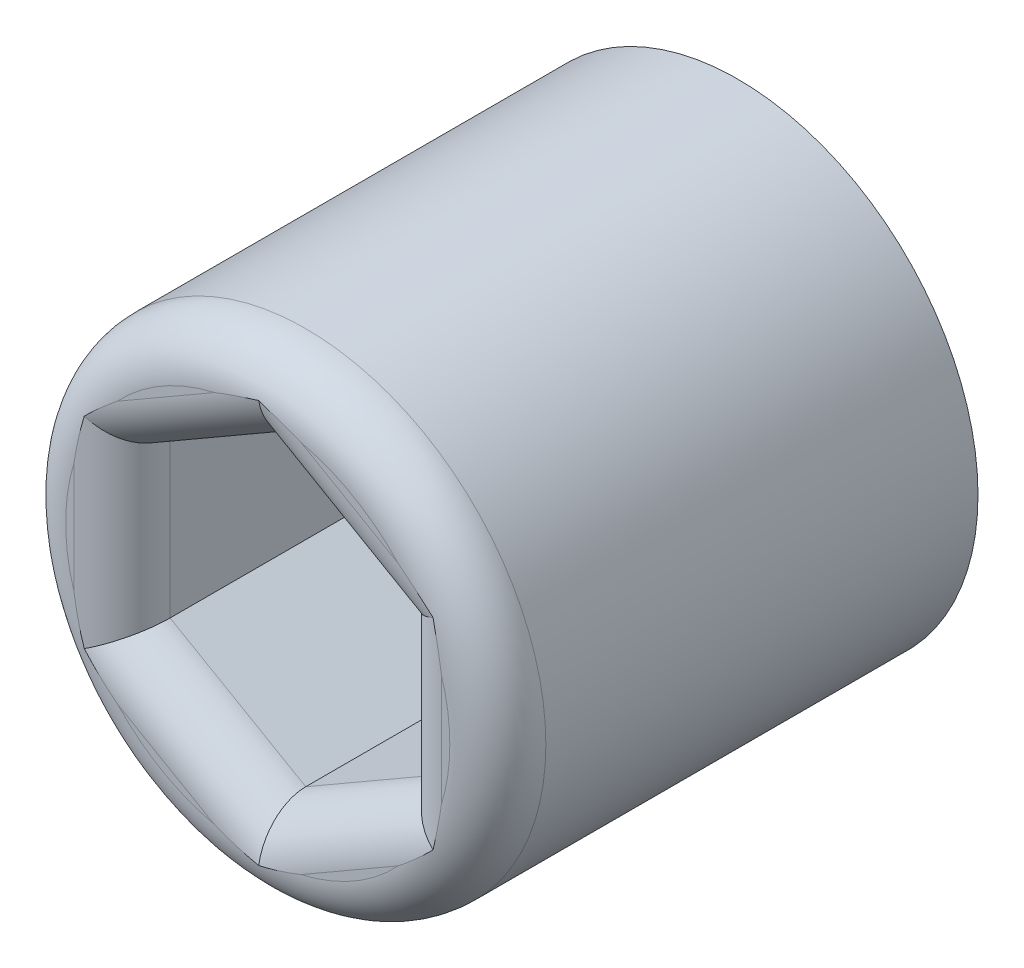
ISO-10303-21;
HEADER;
FILE_DESCRIPTION(('STEP AP214'),'2;1');
FILE_NAME('part.step','',(''),(''),'','','');
FILE_SCHEMA(('AUTOMOTIVE_DESIGN { 1 0 10303 214 1 1 1 1 }'));
ENDSEC;
DATA;
#1=APPLICATION_CONTEXT('core data for automotive mechanical design processes');
#2=APPLICATION_PROTOCOL_DEFINITION('international standard','automotive_design',2000,#1);
#3=PRODUCT_CONTEXT('',#1,'mechanical');
#4=PRODUCT('Part','Part','',(#3));
#5=PRODUCT_RELATED_PRODUCT_CATEGORY('part','',(#4));
#6=PRODUCT_DEFINITION_FORMATION('','',#4);
#7=PRODUCT_DEFINITION_CONTEXT('part definition',#1,'design');
#8=PRODUCT_DEFINITION('design','',#6,#7);
#9=PRODUCT_DEFINITION_SHAPE('','',#8);
#10=(LENGTH_UNIT() NAMED_UNIT(*) SI_UNIT(.MILLI.,.METRE.));
#11=(NAMED_UNIT(*) PLANE_ANGLE_UNIT() SI_UNIT($,.RADIAN.));
#12=(NAMED_UNIT(*) SI_UNIT($,.STERADIAN.) SOLID_ANGLE_UNIT());
#13=UNCERTAINTY_MEASURE_WITH_UNIT(LENGTH_MEASURE(1.E-05),#10,'distance_accuracy_value','');
#14=(GEOMETRIC_REPRESENTATION_CONTEXT(3) GLOBAL_UNCERTAINTY_ASSIGNED_CONTEXT((#13)) GLOBAL_UNIT_ASSIGNED_CONTEXT((#10,
#11,#12)) REPRESENTATION_CONTEXT('',''));
#15=CARTESIAN_POINT('',(0.,0.,0.));
#16=DIRECTION('',(0.,0.,1.));
#17=DIRECTION('',(1.,0.,0.));
#18=AXIS2_PLACEMENT_3D('',#15,#16,#17);
#19=CARTESIAN_POINT('',(0.,0.,10.));
#20=DIRECTION('',(0.,0.,1.));
#21=DIRECTION('',(1.,0.,0.));
#22=AXIS2_PLACEMENT_3D('',#19,#20,#21);
#23=PLANE('',#22);
#24=DIRECTION('',(0.866025403784439,-0.5,0.));
#25=VECTOR('',#24,1.);
#26=CARTESIAN_POINT('',(-3.325,-2.49703991424513,10.));
#27=LINE('',#26,#25);
#28=CARTESIAN_POINT('',(-0.899074497064536,-3.8976486563989,10.));
#29=VERTEX_POINT('',#28);
#30=CARTESIAN_POINT('',(-2.92592550293546,-2.72744568255206,10.));
#31=VERTEX_POINT('',#30);
#32=EDGE_CURVE('E50',#29,#31,#27,.F.);
#33=ORIENTED_EDGE('',*,*,#32,.T.);
#34=CARTESIAN_POINT('',(0.,0.,10.));
#35=DIRECTION('',(0.,0.,1.));
#36=DIRECTION('',(1.,0.,0.));
#37=AXIS2_PLACEMENT_3D('',#34,#35,#36);
#38=CIRCLE('',#37,4.);
#39=EDGE_CURVE('E204',#31,#29,#38,.T.);
#40=ORIENTED_EDGE('',*,*,#39,.T.);
#41=EDGE_LOOP('',(#33,#40));
#42=FACE_BOUND('',#41,.T.);
#43=ADVANCED_FACE('F35',(#42),#23,.T.);
#44=CARTESIAN_POINT('',(-3.825,1.17020297384685,10.));
#45=VERTEX_POINT('',#44);
#46=CARTESIAN_POINT('',(-3.825,-1.17020297384685,10.));
#47=VERTEX_POINT('',#46);
#48=EDGE_CURVE('E381',#45,#47,#38,.T.);
#49=ORIENTED_EDGE('',*,*,#48,.T.);
#50=DIRECTION('',(0.,-1.,0.));
#51=VECTOR('',#50,1.);
#52=CARTESIAN_POINT('',(-3.825,2.78571504883995,10.));
#53=LINE('',#52,#51);
#54=EDGE_CURVE('E388',#47,#45,#53,.F.);
#55=ORIENTED_EDGE('',*,*,#54,.T.);
#56=EDGE_LOOP('',(#49,#55));
#57=FACE_BOUND('',#56,.T.);
#58=ADVANCED_FACE('F341',(#57),#23,.T.);
#59=CARTESIAN_POINT('',(-0.899074497064539,3.8976486563989,10.));
#60=VERTEX_POINT('',#59);
#61=CARTESIAN_POINT('',(-2.92592550293546,2.72744568255206,10.));
#62=VERTEX_POINT('',#61);
#63=EDGE_CURVE('E203',#60,#62,#38,.T.);
#64=ORIENTED_EDGE('',*,*,#63,.T.);
#65=DIRECTION('',(-0.866025403784439,-0.5,0.));
#66=VECTOR('',#65,1.);
#67=CARTESIAN_POINT('',(0.5,4.70540469389545,10.));
#68=LINE('',#67,#66);
#69=EDGE_CURVE('E403',#62,#60,#68,.F.);
#70=ORIENTED_EDGE('',*,*,#69,.T.);
#71=EDGE_LOOP('',(#64,#70));
#72=FACE_BOUND('',#71,.T.);
#73=ADVANCED_FACE('F347',(#72),#23,.T.);
#74=DIRECTION('',(0.866025403784439,0.5,0.));
#75=VECTOR('',#74,1.);
#76=CARTESIAN_POINT('',(0.5,-4.12805442470582,10.));
#77=LINE('',#76,#75);
#78=CARTESIAN_POINT('',(2.92592550293546,-2.72744568255206,10.));
#79=VERTEX_POINT('',#78);
#80=CARTESIAN_POINT('',(0.89907449706454,-3.8976486563989,10.));
#81=VERTEX_POINT('',#80);
#82=EDGE_CURVE('E420',#79,#81,#77,.F.);
#83=ORIENTED_EDGE('',*,*,#82,.T.);
#84=EDGE_CURVE('E379',#81,#79,#38,.T.);
#85=ORIENTED_EDGE('',*,*,#84,.T.);
#86=EDGE_LOOP('',(#83,#85));
#87=FACE_BOUND('',#86,.T.);
#88=ADVANCED_FACE('F361',(#87),#23,.T.);
#89=DIRECTION('',(0.,1.,0.));
#90=VECTOR('',#89,1.);
#91=CARTESIAN_POINT('',(3.825,-1.63101451046069,10.));
#92=LINE('',#91,#90);
#93=CARTESIAN_POINT('',(3.825,1.17020297384685,10.));
#94=VERTEX_POINT('',#93);
#95=CARTESIAN_POINT('',(3.825,-1.17020297384684,10.));
#96=VERTEX_POINT('',#95);
#97=EDGE_CURVE('E214',#94,#96,#92,.F.);
#98=ORIENTED_EDGE('',*,*,#97,.T.);
#99=EDGE_CURVE('E197',#96,#94,#38,.T.);
#100=ORIENTED_EDGE('',*,*,#99,.T.);
#101=EDGE_LOOP('',(#98,#100));
#102=FACE_BOUND('',#101,.T.);
#103=ADVANCED_FACE('F353',(#102),#23,.T.);
#104=CARTESIAN_POINT('',(0.,0.,10.));
#105=DIRECTION('',(0.,0.,-1.));
#106=DIRECTION('',(-1.,0.,0.));
#107=AXIS2_PLACEMENT_3D('',#104,#105,#106);
#108=CYLINDRICAL_SURFACE('',#107,5.);
#109=CARTESIAN_POINT('',(0.,0.,9.));
#110=DIRECTION('',(0.,0.,1.));
#111=DIRECTION('',(1.,0.,0.));
#112=AXIS2_PLACEMENT_3D('',#109,#110,#111);
#113=CIRCLE('',#112,5.);
#114=CARTESIAN_POINT('',(5.,0.,9.));
#115=VERTEX_POINT('',#114);
#116=EDGE_CURVE('E202',#115,#115,#113,.F.);
#117=ORIENTED_EDGE('',*,*,#116,.T.);
#118=EDGE_LOOP('',(#117));
#119=FACE_BOUND('',#118,.T.);
#120=CARTESIAN_POINT('',(0.,0.,0.));
#121=DIRECTION('',(0.,0.,1.));
#122=DIRECTION('',(1.,0.,0.));
#123=AXIS2_PLACEMENT_3D('',#120,#121,#122);
#124=CIRCLE('',#123,5.);
#125=CARTESIAN_POINT('',(5.,0.,0.));
#126=VERTEX_POINT('',#125);
#127=EDGE_CURVE('E185',#126,#126,#124,.T.);
#128=ORIENTED_EDGE('',*,*,#127,.T.);
#129=EDGE_LOOP('',(#128));
#130=FACE_BOUND('',#129,.T.);
#131=ADVANCED_FACE('F242',(#119,#130),#108,.T.);
#132=CARTESIAN_POINT('',(2.92592550293546,2.72744568255206,10.));
#133=VERTEX_POINT('',#132);
#134=CARTESIAN_POINT('',(0.89907449706454,3.8976486563989,10.));
#135=VERTEX_POINT('',#134);
#136=EDGE_CURVE('E199',#133,#135,#38,.T.);
#137=ORIENTED_EDGE('',*,*,#136,.T.);
#138=DIRECTION('',(-0.866025403784439,0.5,0.));
#139=VECTOR('',#138,1.);
#140=CARTESIAN_POINT('',(3.325,2.49703991424513,10.));
#141=LINE('',#140,#139);
#142=EDGE_CURVE('E210',#135,#133,#141,.F.);
#143=ORIENTED_EDGE('',*,*,#142,.T.);
#144=EDGE_LOOP('',(#137,#143));
#145=FACE_BOUND('',#144,.T.);
#146=ADVANCED_FACE('F343',(#145),#23,.T.);
#147=CARTESIAN_POINT('',(0.,0.,0.));
#148=DIRECTION('',(0.,0.,1.));
#149=DIRECTION('',(1.,0.,0.));
#150=AXIS2_PLACEMENT_3D('',#147,#148,#149);
#151=PLANE('',#150);
#152=CARTESIAN_POINT('',(0.,0.,0.));
#153=DIRECTION('',(0.,0.,1.));
#154=DIRECTION('',(1.,0.,0.));
#155=AXIS2_PLACEMENT_3D('',#152,#153,#154);
#156=CIRCLE('',#155,1.8);
#157=CARTESIAN_POINT('',(1.8,0.,0.));
#158=VERTEX_POINT('',#157);
#159=EDGE_CURVE('E169',#158,#158,#156,.T.);
#160=ORIENTED_EDGE('',*,*,#159,.T.);
#161=EDGE_LOOP('',(#160));
#162=FACE_BOUND('',#161,.T.);
#163=ORIENTED_EDGE('',*,*,#127,.F.);
#164=EDGE_LOOP('',(#163));
#165=FACE_BOUND('',#164,.T.);
#166=ADVANCED_FACE('F351',(#162,#165),#151,.F.);
#167=CARTESIAN_POINT('',(0.,-3.26202902092139,2.));
#168=DIRECTION('',(0.5,-0.866025403784439,0.));
#169=DIRECTION('',(0.866025403784439,0.5,0.));
#170=AXIS2_PLACEMENT_3D('',#167,#168,#169);
#171=PLANE('',#170);
#172=DIRECTION('',(0.,0.,1.));
#173=VECTOR('',#172,1.);
#174=CARTESIAN_POINT('',(0.,-3.26202902092139,2.));
#175=LINE('',#174,#173);
#176=CARTESIAN_POINT('',(0.,-3.26202902092139,2.));
#177=VERTEX_POINT('',#176);
#178=CARTESIAN_POINT('',(0.,-3.26202902092139,9.));
#179=VERTEX_POINT('',#178);
#180=EDGE_CURVE('E183',#177,#179,#175,.T.);
#181=ORIENTED_EDGE('',*,*,#180,.T.);
#182=DIRECTION('',(0.866025403784439,0.5,0.));
#183=VECTOR('',#182,1.);
#184=CARTESIAN_POINT('',(3.825,-1.05366424127107,9.));
#185=LINE('',#184,#183);
#186=CARTESIAN_POINT('',(2.825,-1.63101451046069,9.));
#187=VERTEX_POINT('',#186);
#188=EDGE_CURVE('E150',#179,#187,#185,.T.);
#189=ORIENTED_EDGE('',*,*,#188,.T.);
#190=DIRECTION('',(0.,0.,1.));
#191=VECTOR('',#190,1.);
#192=CARTESIAN_POINT('',(2.825,-1.63101451046069,2.));
#193=LINE('',#192,#191);
#194=CARTESIAN_POINT('',(2.825,-1.63101451046069,2.));
#195=VERTEX_POINT('',#194);
#196=EDGE_CURVE('E142',#195,#187,#193,.T.);
#197=ORIENTED_EDGE('',*,*,#196,.F.);
#198=DIRECTION('',(0.866025403784439,0.5,0.));
#199=VECTOR('',#198,1.);
#200=CARTESIAN_POINT('',(0.,-3.26202902092139,2.));
#201=LINE('',#200,#199);
#202=EDGE_CURVE('E147',#177,#195,#201,.T.);
#203=ORIENTED_EDGE('',*,*,#202,.F.);
#204=EDGE_LOOP('',(#181,#189,#197,#203));
#205=FACE_BOUND('',#204,.T.);
#206=ADVANCED_FACE('F145',(#205),#171,.F.);
#207=CARTESIAN_POINT('',(-2.825,-1.63101451046069,2.));
#208=DIRECTION('',(-0.5,-0.866025403784439,0.));
#209=DIRECTION('',(0.866025403784439,-0.5,0.));
#210=AXIS2_PLACEMENT_3D('',#207,#208,#209);
#211=PLANE('',#210);
#212=DIRECTION('',(0.,0.,1.));
#213=VECTOR('',#212,1.);
#214=CARTESIAN_POINT('',(-2.825,-1.63101451046069,2.));
#215=LINE('',#214,#213);
#216=CARTESIAN_POINT('',(-2.825,-1.63101451046069,2.));
#217=VERTEX_POINT('',#216);
#218=CARTESIAN_POINT('',(-2.825,-1.63101451046069,9.));
#219=VERTEX_POINT('',#218);
#220=EDGE_CURVE('E186',#217,#219,#215,.T.);
#221=ORIENTED_EDGE('',*,*,#220,.T.);
#222=DIRECTION('',(0.866025403784439,-0.5,0.));
#223=VECTOR('',#222,1.);
#224=CARTESIAN_POINT('',(0.999999999999999,-3.83937929011101,9.));
#225=LINE('',#224,#223);
#226=EDGE_CURVE('E414',#219,#179,#225,.T.);
#227=ORIENTED_EDGE('',*,*,#226,.T.);
#228=ORIENTED_EDGE('',*,*,#180,.F.);
#229=DIRECTION('',(0.866025403784439,-0.5,0.));
#230=VECTOR('',#229,1.);
#231=CARTESIAN_POINT('',(-2.825,-1.63101451046069,2.));
#232=LINE('',#231,#230);
#233=EDGE_CURVE('E155',#217,#177,#232,.T.);
#234=ORIENTED_EDGE('',*,*,#233,.F.);
#235=EDGE_LOOP('',(#221,#227,#228,#234));
#236=FACE_BOUND('',#235,.T.);
#237=ADVANCED_FACE('F418',(#236),#211,.F.);
#238=CARTESIAN_POINT('',(-2.825,1.63101451046069,2.));
#239=DIRECTION('',(-1.,0.,0.));
#240=DIRECTION('',(0.,0.,1.));
#241=AXIS2_PLACEMENT_3D('',#238,#239,#240);
#242=PLANE('',#241);
#243=DIRECTION('',(0.,0.,1.));
#244=VECTOR('',#243,1.);
#245=CARTESIAN_POINT('',(-2.825,1.63101451046069,2.));
#246=LINE('',#245,#244);
#247=CARTESIAN_POINT('',(-2.825,1.63101451046069,2.));
#248=VERTEX_POINT('',#247);
#249=CARTESIAN_POINT('',(-2.825,1.63101451046069,9.));
#250=VERTEX_POINT('',#249);
#251=EDGE_CURVE('E189',#248,#250,#246,.T.);
#252=ORIENTED_EDGE('',*,*,#251,.T.);
#253=DIRECTION('',(0.,-1.,0.));
#254=VECTOR('',#253,1.);
#255=CARTESIAN_POINT('',(-2.825,-2.78571504883995,9.));
#256=LINE('',#255,#254);
#257=EDGE_CURVE('E393',#250,#219,#256,.T.);
#258=ORIENTED_EDGE('',*,*,#257,.T.);
#259=ORIENTED_EDGE('',*,*,#220,.F.);
#260=DIRECTION('',(0.,-1.,0.));
#261=VECTOR('',#260,1.);
#262=CARTESIAN_POINT('',(-2.825,1.63101451046069,2.));
#263=LINE('',#262,#261);
#264=EDGE_CURVE('E180',#248,#217,#263,.T.);
#265=ORIENTED_EDGE('',*,*,#264,.F.);
#266=EDGE_LOOP('',(#252,#258,#259,#265));
#267=FACE_BOUND('',#266,.T.);
#268=ADVANCED_FACE('F481',(#267),#242,.F.);
#269=CARTESIAN_POINT('',(0.,3.26202902092139,2.));
#270=DIRECTION('',(-0.5,0.866025403784439,0.));
#271=DIRECTION('',(-0.866025403784439,-0.5,0.));
#272=AXIS2_PLACEMENT_3D('',#269,#270,#271);
#273=PLANE('',#272);
#274=DIRECTION('',(0.,0.,1.));
#275=VECTOR('',#274,1.);
#276=CARTESIAN_POINT('',(0.,3.26202902092139,2.));
#277=LINE('',#276,#275);
#278=CARTESIAN_POINT('',(0.,3.26202902092139,2.));
#279=VERTEX_POINT('',#278);
#280=CARTESIAN_POINT('',(0.,3.26202902092139,9.));
#281=VERTEX_POINT('',#280);
#282=EDGE_CURVE('E192',#279,#281,#277,.T.);
#283=ORIENTED_EDGE('',*,*,#282,.T.);
#284=DIRECTION('',(-0.866025403784439,-0.5,0.));
#285=VECTOR('',#284,1.);
#286=CARTESIAN_POINT('',(-2.825,1.63101451046069,9.));
#287=LINE('',#286,#285);
#288=EDGE_CURVE('E405',#281,#250,#287,.T.);
#289=ORIENTED_EDGE('',*,*,#288,.T.);
#290=ORIENTED_EDGE('',*,*,#251,.F.);
#291=DIRECTION('',(-0.866025403784439,-0.5,0.));
#292=VECTOR('',#291,1.);
#293=CARTESIAN_POINT('',(0.,3.26202902092139,2.));
#294=LINE('',#293,#292);
#295=EDGE_CURVE('E177',#279,#248,#294,.T.);
#296=ORIENTED_EDGE('',*,*,#295,.F.);
#297=EDGE_LOOP('',(#283,#289,#290,#296));
#298=FACE_BOUND('',#297,.T.);
#299=ADVANCED_FACE('F491',(#298),#273,.F.);
#300=CARTESIAN_POINT('',(2.825,1.63101451046069,2.));
#301=DIRECTION('',(0.5,0.866025403784439,0.));
#302=DIRECTION('',(-0.866025403784439,0.5,0.));
#303=AXIS2_PLACEMENT_3D('',#300,#301,#302);
#304=PLANE('',#303);
#305=DIRECTION('',(0.,0.,1.));
#306=VECTOR('',#305,1.);
#307=CARTESIAN_POINT('',(2.825,1.63101451046069,2.));
#308=LINE('',#307,#306);
#309=CARTESIAN_POINT('',(2.825,1.63101451046069,2.));
#310=VERTEX_POINT('',#309);
#311=CARTESIAN_POINT('',(2.825,1.63101451046069,9.));
#312=VERTEX_POINT('',#311);
#313=EDGE_CURVE('E154',#310,#312,#308,.T.);
#314=ORIENTED_EDGE('',*,*,#313,.T.);
#315=DIRECTION('',(-0.866025403784439,0.5,0.));
#316=VECTOR('',#315,1.);
#317=CARTESIAN_POINT('',(0.,3.26202902092139,9.));
#318=LINE('',#317,#316);
#319=EDGE_CURVE('E207',#312,#281,#318,.T.);
#320=ORIENTED_EDGE('',*,*,#319,.T.);
#321=ORIENTED_EDGE('',*,*,#282,.F.);
#322=DIRECTION('',(-0.866025403784439,0.5,0.));
#323=VECTOR('',#322,1.);
#324=CARTESIAN_POINT('',(2.825,1.63101451046069,2.));
#325=LINE('',#324,#323);
#326=EDGE_CURVE('E164',#310,#279,#325,.T.);
#327=ORIENTED_EDGE('',*,*,#326,.F.);
#328=EDGE_LOOP('',(#314,#320,#321,#327));
#329=FACE_BOUND('',#328,.T.);
#330=ADVANCED_FACE('F425',(#329),#304,.F.);
#331=CARTESIAN_POINT('',(2.825,-1.63101451046069,2.));
#332=DIRECTION('',(1.,0.,0.));
#333=DIRECTION('',(0.,1.,0.));
#334=AXIS2_PLACEMENT_3D('',#331,#332,#333);
#335=PLANE('',#334);
#336=ORIENTED_EDGE('',*,*,#196,.T.);
#337=DIRECTION('',(0.,1.,0.));
#338=VECTOR('',#337,1.);
#339=CARTESIAN_POINT('',(2.825,2.78571504883995,9.));
#340=LINE('',#339,#338);
#341=EDGE_CURVE('E212',#187,#312,#340,.T.);
#342=ORIENTED_EDGE('',*,*,#341,.T.);
#343=ORIENTED_EDGE('',*,*,#313,.F.);
#344=DIRECTION('',(0.,1.,0.));
#345=VECTOR('',#344,1.);
#346=CARTESIAN_POINT('',(2.825,-1.63101451046069,2.));
#347=LINE('',#346,#345);
#348=EDGE_CURVE('E158',#195,#310,#347,.T.);
#349=ORIENTED_EDGE('',*,*,#348,.F.);
#350=EDGE_LOOP('',(#336,#342,#343,#349));
#351=FACE_BOUND('',#350,.T.);
#352=ADVANCED_FACE('F159',(#351),#335,.F.);
#353=CARTESIAN_POINT('',(0.,0.,2.));
#354=DIRECTION('',(0.,0.,1.));
#355=DIRECTION('',(1.,0.,0.));
#356=AXIS2_PLACEMENT_3D('',#353,#354,#355);
#357=PLANE('',#356);
#358=CARTESIAN_POINT('',(0.,0.,2.));
#359=DIRECTION('',(0.,0.,1.));
#360=DIRECTION('',(1.,0.,0.));
#361=AXIS2_PLACEMENT_3D('',#358,#359,#360);
#362=CIRCLE('',#361,1.8);
#363=CARTESIAN_POINT('',(1.8,0.,2.));
#364=VERTEX_POINT('',#363);
#365=EDGE_CURVE('E172',#364,#364,#362,.T.);
#366=ORIENTED_EDGE('',*,*,#365,.F.);
#367=EDGE_LOOP('',(#366));
#368=FACE_BOUND('',#367,.T.);
#369=ORIENTED_EDGE('',*,*,#202,.T.);
#370=ORIENTED_EDGE('',*,*,#348,.T.);
#371=ORIENTED_EDGE('',*,*,#326,.T.);
#372=ORIENTED_EDGE('',*,*,#295,.T.);
#373=ORIENTED_EDGE('',*,*,#264,.T.);
#374=ORIENTED_EDGE('',*,*,#233,.T.);
#375=EDGE_LOOP('',(#369,#370,#371,#372,#373,#374));
#376=FACE_BOUND('',#375,.T.);
#377=ADVANCED_FACE('F166',(#368,#376),#357,.T.);
#378=CARTESIAN_POINT('',(0.,0.,-6.));
#379=DIRECTION('',(0.,0.,1.));
#380=DIRECTION('',(1.,0.,0.));
#381=AXIS2_PLACEMENT_3D('',#378,#379,#380);
#382=CYLINDRICAL_SURFACE('',#381,1.8);
#383=ORIENTED_EDGE('',*,*,#365,.T.);
#384=EDGE_LOOP('',(#383));
#385=FACE_BOUND('',#384,.T.);
#386=ORIENTED_EDGE('',*,*,#159,.F.);
#387=EDGE_LOOP('',(#386));
#388=FACE_BOUND('',#387,.T.);
#389=ADVANCED_FACE('F240',(#385,#388),#382,.F.);
#390=CARTESIAN_POINT('',(0.,0.,9.));
#391=DIRECTION('',(0.,0.,1.));
#392=DIRECTION('',(1.,0.,0.));
#393=AXIS2_PLACEMENT_3D('',#390,#391,#392);
#394=TOROIDAL_SURFACE('',#393,4.,1.);
#395=ORIENTED_EDGE('',*,*,#116,.F.);
#396=EDGE_LOOP('',(#395));
#397=FACE_BOUND('',#396,.T.);
#398=ORIENTED_EDGE('',*,*,#39,.F.);
#399=CARTESIAN_POINT('',(-3.63159513845293,-2.09670243077354,9.98111903433272));
#400=CARTESIAN_POINT('',(-3.56027201876369,-2.16803109496549,9.9862410442853));
#401=CARTESIAN_POINT('',(-3.48766109014127,-2.23815089747661,9.98999779101937));
#402=CARTESIAN_POINT('',(-3.33995350652697,-2.37576721622156,9.99549888764924));
#403=CARTESIAN_POINT('',(-3.26485750164819,-2.44326440865824,9.99724375965042));
#404=CARTESIAN_POINT('',(-3.12181149499562,-2.56716995298615,9.99930323810991));
#405=CARTESIAN_POINT('',(-3.05414771495553,-2.62390672452734,9.99976988312708));
#406=CARTESIAN_POINT('',(-2.96879789211084,-2.6931357143392,9.99997149027267));
#407=CARTESIAN_POINT('',(-2.95196128187441,-2.70668120855078,9.99999288014537));
#408=CARTESIAN_POINT('',(-2.93202403798993,-2.72259015634584,9.99999950192611));
#409=CARTESIAN_POINT('',(-2.92897564854584,-2.72501902073999,10.000000000408));
#410=CARTESIAN_POINT('',(-2.92592550293546,-2.72744568255206,10.));
#411=B_SPLINE_CURVE_WITH_KNOTS('',3,(#399,#400,#401,#402,#403,#404,#405,#406,#407,#408,#409,
#410),.UNSPECIFIED.,.F.,.F.,(4,2,2,2,2,4),(0.,0.302956387456523,0.605834136422754,
0.870693889473649,0.935520722406487,0.947213818254955),.UNSPECIFIED.);
#412=CARTESIAN_POINT('',(-3.63159513845293,-2.09670243077354,9.98111903433272));
#413=VERTEX_POINT('',#412);
#414=EDGE_CURVE('E319',#31,#413,#411,.F.);
#415=ORIENTED_EDGE('',*,*,#414,.T.);
#416=CARTESIAN_POINT('',(-3.825,-1.17020297384685,10.));
#417=CARTESIAN_POINT('',(-3.82442352971388,-1.17405778356289,9.99999998108179));
#418=CARTESIAN_POINT('',(-3.82384426588735,-1.17791219924103,9.99999948349431));
#419=CARTESIAN_POINT('',(-3.79816389164172,-1.34795232430375,9.99995565225555));
#420=CARTESIAN_POINT('',(-3.76787689529914,-1.51339752115899,9.99899083054549));
#421=CARTESIAN_POINT('',(-3.69739953509713,-1.8420976327914,9.99246019900903));
#422=CARTESIAN_POINT('',(-3.65720896319751,-2.00535250148131,9.98689429252382));
#423=CARTESIAN_POINT('',(-3.58979501886204,-2.2487817061164,9.97221817210031));
#424=CARTESIAN_POINT('',(-3.56599379520431,-2.330099239582,9.96622388644281));
#425=CARTESIAN_POINT('',(-3.51617671289105,-2.49178453797813,9.95147516901658));
#426=CARTESIAN_POINT('',(-3.49016143787323,-2.57215254688678,9.94272146301316));
#427=CARTESIAN_POINT('',(-3.43601382680276,-2.73192270098579,9.92170278076633));
#428=CARTESIAN_POINT('',(-3.40787702172173,-2.81132237344067,9.90943023060336));
#429=CARTESIAN_POINT('',(-3.36428993751954,-2.92934093872518,9.8876989748455));
#430=CARTESIAN_POINT('',(-3.34952284225632,-2.96851968363036,9.87989673597144));
#431=CARTESIAN_POINT('',(-3.31956958461571,-3.04645388599156,9.86303766685439));
#432=CARTESIAN_POINT('',(-3.30438333297931,-3.08520925079803,9.85398056771336));
#433=CARTESIAN_POINT('',(-3.28900949082261,-3.12371997282526,9.84422400704542));
#434=B_SPLINE_CURVE_WITH_KNOTS('',3,(#416,#417,#418,#419,#420,#421,#422,#423,#424,#425,#426,
#427,#428,#429,#430,#431,#432,#433),.UNSPECIFIED.,.F.,.F.,(4,2,2,2,2,2,2,2,4),(0.,
0.011693095848469,0.515902077490165,1.02012165173769,1.27488008751258,1.52957157416018,
1.78481542480854,1.91256557329033,2.04034313920574),.UNSPECIFIED.);
#435=EDGE_CURVE('E314',#413,#47,#434,.F.);
#436=ORIENTED_EDGE('',*,*,#435,.T.);
#437=ORIENTED_EDGE('',*,*,#48,.F.);
#438=CARTESIAN_POINT('',(-3.825,1.17020297384685,10.));
#439=CARTESIAN_POINT('',(-3.82442352971388,1.17405778356289,9.99999998108179));
#440=CARTESIAN_POINT('',(-3.82384426588735,1.17791219924103,9.99999948349431));
#441=CARTESIAN_POINT('',(-3.79816389164172,1.34795232430375,9.99995565225555));
#442=CARTESIAN_POINT('',(-3.76787689529914,1.51339752115899,9.99899083054549));
#443=CARTESIAN_POINT('',(-3.69739953509713,1.8420976327914,9.99246019900903));
#444=CARTESIAN_POINT('',(-3.65720896319751,2.00535250148131,9.98689429252382));
#445=CARTESIAN_POINT('',(-3.58979501886204,2.2487817061164,9.97221817210031));
#446=CARTESIAN_POINT('',(-3.56599379520431,2.330099239582,9.96622388644281));
#447=CARTESIAN_POINT('',(-3.51617671289105,2.49178453797813,9.95147516901658));
#448=CARTESIAN_POINT('',(-3.49016143787323,2.57215254688678,9.94272146301316));
#449=CARTESIAN_POINT('',(-3.43601382680276,2.73192270098579,9.92170278076633));
#450=CARTESIAN_POINT('',(-3.40787702172173,2.81132237344067,9.90943023060336));
#451=CARTESIAN_POINT('',(-3.36428993751954,2.92934093872518,9.8876989748455));
#452=CARTESIAN_POINT('',(-3.34952284225632,2.96851968363036,9.87989673597144));
#453=CARTESIAN_POINT('',(-3.31956958461571,3.04645388599156,9.86303766685439));
#454=CARTESIAN_POINT('',(-3.30438333297931,3.08520925079803,9.85398056771336));
#455=CARTESIAN_POINT('',(-3.28900949082261,3.12371997282526,9.84422400704542));
#456=B_SPLINE_CURVE_WITH_KNOTS('',3,(#438,#439,#440,#441,#442,#443,#444,#445,#446,#447,#448,
#449,#450,#451,#452,#453,#454,#455),.UNSPECIFIED.,.F.,.F.,(4,2,2,2,2,2,2,2,4),(0.,
0.011693095848469,0.515902077490165,1.02012165173769,1.27488008751258,1.52957157416018,
1.78481542480854,1.91256557329033,2.04034313920574),.UNSPECIFIED.);
#457=CARTESIAN_POINT('',(-3.63159513845293,2.09670243077354,9.98111903433272));
#458=VERTEX_POINT('',#457);
#459=EDGE_CURVE('E308',#45,#458,#456,.T.);
#460=ORIENTED_EDGE('',*,*,#459,.T.);
#461=CARTESIAN_POINT('',(-3.63159513845293,2.09670243077354,9.98111903433272));
#462=CARTESIAN_POINT('',(-3.56027201876369,2.16803109496549,9.9862410442853));
#463=CARTESIAN_POINT('',(-3.48766109014127,2.23815089747661,9.98999779101937));
#464=CARTESIAN_POINT('',(-3.33995350652697,2.37576721622156,9.99549888764924));
#465=CARTESIAN_POINT('',(-3.2648575016482,2.44326440865824,9.99724375965042));
#466=CARTESIAN_POINT('',(-3.12181149499563,2.56716995298614,9.99930323810991));
#467=CARTESIAN_POINT('',(-3.05414771495553,2.62390672452733,9.99976988312708));
#468=CARTESIAN_POINT('',(-2.96879789211085,2.6931357143392,9.99997149027267));
#469=CARTESIAN_POINT('',(-2.95196128187442,2.70668120855078,9.99999288014537));
#470=CARTESIAN_POINT('',(-2.93202403798993,2.72259015634584,9.99999950192611));
#471=CARTESIAN_POINT('',(-2.92897564854584,2.72501902074,10.000000000408));
#472=CARTESIAN_POINT('',(-2.92592550293546,2.72744568255206,10.));
#473=B_SPLINE_CURVE_WITH_KNOTS('',3,(#461,#462,#463,#464,#465,#466,#467,#468,#469,#470,#471,
#472),.UNSPECIFIED.,.F.,.F.,(4,2,2,2,2,4),(0.,0.302956387456522,0.605834136422749,
0.870693889473633,0.935520722406488,0.947213818254957),.UNSPECIFIED.);
#474=EDGE_CURVE('E301',#458,#62,#473,.T.);
#475=ORIENTED_EDGE('',*,*,#474,.T.);
#476=ORIENTED_EDGE('',*,*,#63,.F.);
#477=CARTESIAN_POINT('',(-0.899074497064539,3.8976486563989,10.));
#478=CARTESIAN_POINT('',(-0.895447898780633,3.89907682334462,9.99999998108179));
#479=CARTESIAN_POINT('',(-0.891820244973351,3.90050237399442,9.99999948349431));
#480=CARTESIAN_POINT('',(-0.731720989883543,3.96328258005038,9.99995565225555));
#481=CARTESIAN_POINT('',(-0.573297748301493,4.01977587024099,9.99899083054549));
#482=CARTESIAN_POINT('',(-0.253396421300038,4.12309074173058,9.99246019900903));
#483=CARTESIAN_POINT('',(-0.0919182717732798,4.16991211981784,9.98689429252382));
#484=CARTESIAN_POINT('',(0.152604575631482,4.23324453377156,9.97221817210031));
#485=CARTESIAN_POINT('',(0.234928237214644,4.25329083617562,9.96622388644281));
#486=CARTESIAN_POINT('',(0.399860354200794,4.29099062654797,9.95147516901658));
#487=CARTESIAN_POINT('',(0.482468729076168,4.30864474195043,9.94272146301316));
#488=CARTESIAN_POINT('',(0.647907546827701,4.34163661225866,9.92170278076633));
#489=CARTESIAN_POINT('',(0.730738082766299,4.35696926050461,9.90943023060337));
#490=CARTESIAN_POINT('',(0.85473870052197,4.37823102095087,9.8876989748455));
#491=CARTESIAN_POINT('',(0.896052036529861,4.38503171376541,9.87989673597145));
#492=CARTESIAN_POINT('',(0.978521664418643,4.39805853290313,9.8630376668544));
#493=CARTESIAN_POINT('',(1.01967792069217,4.40428453560099,9.85398056771336));
#494=CARTESIAN_POINT('',(1.06071610536419,4.41022575875313,9.84422400704542));
#495=B_SPLINE_CURVE_WITH_KNOTS('',3,(#477,#478,#479,#480,#481,#482,#483,#484,#485,#486,#487,
#488,#489,#490,#491,#492,#493,#494),.UNSPECIFIED.,.F.,.F.,(4,2,2,2,2,2,2,2,4),(0.,
0.0116930958484708,0.515902077490162,1.02012165173768,1.27488008751258,1.52957157416017,
1.78481542480852,1.91256557329032,2.04034313920573),.UNSPECIFIED.);
#496=CARTESIAN_POINT('',(0.,4.19340486154707,9.98111903433272));
#497=VERTEX_POINT('',#496);
#498=EDGE_CURVE('E293',#60,#497,#495,.T.);
#499=ORIENTED_EDGE('',*,*,#498,.T.);
#500=CARTESIAN_POINT('',(0.,4.19340486154707,9.98111903433272));
#501=CARTESIAN_POINT('',(0.0974339950528545,4.167301560115,9.98624104428529));
#502=CARTESIAN_POINT('',(0.194464989647049,4.13947855259117,9.98999779101937));
#503=CARTESIAN_POINT('',(0.387498009462636,4.08036819222205,9.99549888764924));
#504=CARTESIAN_POINT('',(0.483500295236316,4.04908174049266,9.99724375965042));
#505=CARTESIAN_POINT('',(0.662328647620299,3.98715303698555,9.99930323810991));
#506=CARTESIAN_POINT('',(0.745296023123726,3.95692287032531,9.99976988312708));
#507=CARTESIAN_POINT('',(0.847924998401489,3.91762225043929,9.99997149027267));
#508=CARTESIAN_POINT('',(0.86807404561375,3.90981406536673,9.99999288014537));
#509=CARTESIAN_POINT('',(0.891820220493981,3.90050237957884,9.99999950192611));
#510=CARTESIAN_POINT('',(0.895447873483712,3.8990768290767,10.000000000408));
#511=CARTESIAN_POINT('',(0.899074497064536,3.8976486563989,10.));
#512=B_SPLINE_CURVE_WITH_KNOTS('',3,(#500,#501,#502,#503,#504,#505,#506,#507,#508,#509,#510,
#511),.UNSPECIFIED.,.F.,.F.,(4,2,2,2,2,4),(0.,0.302956387456535,0.60583413642276,
0.870693889473666,0.935520722406491,0.94721381825496),.UNSPECIFIED.);
#513=EDGE_CURVE('E285',#497,#135,#512,.T.);
#514=ORIENTED_EDGE('',*,*,#513,.T.);
#515=ORIENTED_EDGE('',*,*,#136,.F.);
#516=CARTESIAN_POINT('',(3.63159513845293,2.09670243077354,9.98111903433272));
#517=CARTESIAN_POINT('',(3.5602720187637,2.16803109496549,9.9862410442853));
#518=CARTESIAN_POINT('',(3.48766109014128,2.23815089747661,9.98999779101937));
#519=CARTESIAN_POINT('',(3.33995350652697,2.37576721622156,9.99549888764924));
#520=CARTESIAN_POINT('',(3.26485750164819,2.44326440865824,9.99724375965042));
#521=CARTESIAN_POINT('',(3.12181149499563,2.56716995298615,9.99930323810991));
#522=CARTESIAN_POINT('',(3.05414771495553,2.62390672452735,9.99976988312708));
#523=CARTESIAN_POINT('',(2.96879789211084,2.6931357143392,9.99997149027267));
#524=CARTESIAN_POINT('',(2.9519612818744,2.70668120855077,9.99999288014537));
#525=CARTESIAN_POINT('',(2.93202403798993,2.72259015634584,9.99999950192611));
#526=CARTESIAN_POINT('',(2.92897564854584,2.72501902074,10.000000000408));
#527=CARTESIAN_POINT('',(2.92592550293546,2.72744568255206,10.));
#528=B_SPLINE_CURVE_WITH_KNOTS('',3,(#516,#517,#518,#519,#520,#521,#522,#523,#524,#525,#526,
#527),.UNSPECIFIED.,.F.,.F.,(4,2,2,2,2,4),(0.,0.302956387456522,0.605834136422756,
0.870693889473649,0.935520722406491,0.947213818254959),.UNSPECIFIED.);
#529=CARTESIAN_POINT('',(3.63159513845293,2.09670243077354,9.98111903433272));
#530=VERTEX_POINT('',#529);
#531=EDGE_CURVE('E225',#133,#530,#528,.F.);
#532=ORIENTED_EDGE('',*,*,#531,.T.);
#533=CARTESIAN_POINT('',(3.825,1.17020297384685,10.));
#534=CARTESIAN_POINT('',(3.82442352971388,1.17405778356289,9.99999998108179));
#535=CARTESIAN_POINT('',(3.82384426588735,1.17791219924103,9.99999948349431));
#536=CARTESIAN_POINT('',(3.79816389164172,1.34795232430375,9.99995565225555));
#537=CARTESIAN_POINT('',(3.76787689529914,1.51339752115899,9.99899083054549));
#538=CARTESIAN_POINT('',(3.69739953509713,1.8420976327914,9.99246019900903));
#539=CARTESIAN_POINT('',(3.65720896319751,2.00535250148131,9.98689429252382));
#540=CARTESIAN_POINT('',(3.58979501886204,2.2487817061164,9.97221817210031));
#541=CARTESIAN_POINT('',(3.56599379520431,2.330099239582,9.96622388644281));
#542=CARTESIAN_POINT('',(3.51617671289105,2.49178453797813,9.95147516901658));
#543=CARTESIAN_POINT('',(3.49016143787323,2.57215254688678,9.94272146301316));
#544=CARTESIAN_POINT('',(3.43601382680275,2.73192270098579,9.92170278076633));
#545=CARTESIAN_POINT('',(3.40787702172173,2.81132237344067,9.90943023060336));
#546=CARTESIAN_POINT('',(3.36428993751954,2.92934093872518,9.8876989748455));
#547=CARTESIAN_POINT('',(3.34952284225632,2.96851968363036,9.87989673597144));
#548=CARTESIAN_POINT('',(3.3195695846157,3.04645388599156,9.86303766685439));
#549=CARTESIAN_POINT('',(3.30438333297931,3.08520925079803,9.85398056771335));
#550=CARTESIAN_POINT('',(3.28900949082261,3.12371997282527,9.84422400704542));
#551=B_SPLINE_CURVE_WITH_KNOTS('',3,(#533,#534,#535,#536,#537,#538,#539,#540,#541,#542,#543,
#544,#545,#546,#547,#548,#549,#550),.UNSPECIFIED.,.F.,.F.,(4,2,2,2,2,2,2,2,4),(0.,
0.0116930958484694,0.515902077490166,1.02012165173769,1.27488008751258,1.52957157416018,
1.78481542480854,1.91256557329033,2.04034313920575),.UNSPECIFIED.);
#552=EDGE_CURVE('E216',#530,#94,#551,.F.);
#553=ORIENTED_EDGE('',*,*,#552,.T.);
#554=ORIENTED_EDGE('',*,*,#99,.F.);
#555=CARTESIAN_POINT('',(3.63159513845293,-2.09670243077354,9.98111903433272));
#556=CARTESIAN_POINT('',(3.65770601381655,-1.99927046514952,9.9862410442853));
#557=CARTESIAN_POINT('',(3.68212607978832,-1.90132765511457,9.98999779101937));
#558=CARTESIAN_POINT('',(3.72745151598959,-1.70460097600049,9.99549888764924));
#559=CARTESIAN_POINT('',(3.7483577968845,-1.60581733183441,9.99724375965042));
#560=CARTESIAN_POINT('',(3.78414014261592,-1.41998308399942,9.99930323810991));
#561=CARTESIAN_POINT('',(3.79944373807925,-1.33301614579801,9.99976988312708));
#562=CARTESIAN_POINT('',(3.81672289051232,-1.22448653610009,9.99997149027267));
#563=CARTESIAN_POINT('',(3.82003532748815,-1.20313285681593,9.99999288014537));
#564=CARTESIAN_POINT('',(3.82384425848391,-1.17791222323299,9.99999950192611));
#565=CARTESIAN_POINT('',(3.82442352202955,-1.1740578083367,10.000000000408));
#566=CARTESIAN_POINT('',(3.825,-1.17020297384684,10.));
#567=B_SPLINE_CURVE_WITH_KNOTS('',3,(#555,#556,#557,#558,#559,#560,#561,#562,#563,#564,#565,
#566),.UNSPECIFIED.,.F.,.F.,(4,2,2,2,2,4),(0.,0.302956387456523,0.605834136422753,
0.870693889473647,0.935520722406489,0.947213818254959),.UNSPECIFIED.);
#568=CARTESIAN_POINT('',(3.63159513845293,-2.09670243077354,9.98111903433272));
#569=VERTEX_POINT('',#568);
#570=EDGE_CURVE('E260',#96,#569,#567,.F.);
#571=ORIENTED_EDGE('',*,*,#570,.T.);
#572=CARTESIAN_POINT('',(2.92592550293546,-2.72744568255205,10.));
#573=CARTESIAN_POINT('',(2.92897563093326,-2.72501903978175,9.99999998108179));
#574=CARTESIAN_POINT('',(2.93202402091403,-2.72259017475342,9.99999948349431));
#575=CARTESIAN_POINT('',(3.06644290175862,-2.61533025574747,9.99995565225553));
#576=CARTESIAN_POINT('',(3.19457914699752,-2.50637834908244,9.99899083054549));
#577=CARTESIAN_POINT('',(3.44400311379642,-2.28099310893948,9.99246019900906));
#578=CARTESIAN_POINT('',(3.56529069142359,-2.16455961833711,9.98689429252385));
#579=CARTESIAN_POINT('',(3.74239959449284,-1.98446282765591,9.97221817210038));
#580=CARTESIAN_POINT('',(3.80092203241827,-1.92319159659437,9.96622388644289));
#581=CARTESIAN_POINT('',(3.91603706709116,-1.79920608857059,9.95147516901668));
#582=CARTESIAN_POINT('',(3.97263016694874,-1.73649219506441,9.94272146301327));
#583=CARTESIAN_POINT('',(4.08392137362977,-1.60971391127369,9.92170278076648));
#584=CARTESIAN_POINT('',(4.13861510448732,-1.5456468870648,9.90943023060354));
#585=CARTESIAN_POINT('',(4.21902863804076,-1.44889008222663,9.88769897484572));
#586=CARTESIAN_POINT('',(4.24557487878542,-1.41651203013601,9.87989673597168));
#587=CARTESIAN_POINT('',(4.29809124903356,-1.35160464691259,9.86303766685467));
#588=CARTESIAN_POINT('',(4.32406125367068,-1.319075284804,9.85398056771365));
#589=CARTESIAN_POINT('',(4.34972559618599,-1.28650578592893,9.84422400704573));
#590=B_SPLINE_CURVE_WITH_KNOTS('',3,(#572,#573,#574,#575,#576,#577,#578,#579,#580,#581,#582,
#583,#584,#585,#586,#587,#588,#589),.UNSPECIFIED.,.F.,.F.,(4,2,2,2,2,2,2,2,4),(0.,
0.0116930958484688,0.515902077489597,1.02012165173668,1.27488008751156,1.52957157415917,
1.78481542480735,1.91256557328904,2.04034313920436),.UNSPECIFIED.);
#591=EDGE_CURVE('E252',#569,#79,#590,.F.);
#592=ORIENTED_EDGE('',*,*,#591,.T.);
#593=ORIENTED_EDGE('',*,*,#84,.F.);
#594=CARTESIAN_POINT('',(0.,-4.19340486154707,9.98111903433272));
#595=CARTESIAN_POINT('',(0.0974339950528563,-4.16730156011501,9.9862410442853));
#596=CARTESIAN_POINT('',(0.194464989647045,-4.13947855259118,9.98999779101937));
#597=CARTESIAN_POINT('',(0.387498009462625,-4.08036819222205,9.99549888764924));
#598=CARTESIAN_POINT('',(0.483500295236304,-4.04908174049265,9.99724375965042));
#599=CARTESIAN_POINT('',(0.662328647620295,-3.98715303698556,9.99930323810991));
#600=CARTESIAN_POINT('',(0.745296023123729,-3.95692287032535,9.99976988312708));
#601=CARTESIAN_POINT('',(0.847924998401474,-3.91762225043928,9.99997149027267));
#602=CARTESIAN_POINT('',(0.868074045613734,-3.9098140653667,9.99999288014537));
#603=CARTESIAN_POINT('',(0.891820220493978,-3.90050237957883,9.99999950192611));
#604=CARTESIAN_POINT('',(0.895447873483711,-3.8990768290767,10.000000000408));
#605=CARTESIAN_POINT('',(0.899074497064537,-3.8976486563989,10.));
#606=B_SPLINE_CURVE_WITH_KNOTS('',3,(#594,#595,#596,#597,#598,#599,#600,#601,#602,#603,#604,
#605),.UNSPECIFIED.,.F.,.F.,(4,2,2,2,2,4),(0.,0.302956387456523,0.605834136422755,
0.87069388947365,0.93552072240649,0.947213818254959),.UNSPECIFIED.);
#607=CARTESIAN_POINT('',(0.,-4.19340486154707,9.98111903433272));
#608=VERTEX_POINT('',#607);
#609=EDGE_CURVE('E277',#81,#608,#606,.F.);
#610=ORIENTED_EDGE('',*,*,#609,.T.);
#611=CARTESIAN_POINT('',(-0.899074497064537,-3.8976486563989,10.));
#612=CARTESIAN_POINT('',(-0.895447898780631,-3.89907682334462,9.99999998108179));
#613=CARTESIAN_POINT('',(-0.89182024497335,-3.90050237399442,9.99999948349431));
#614=CARTESIAN_POINT('',(-0.731720989883542,-3.96328258005038,9.99995565225555));
#615=CARTESIAN_POINT('',(-0.573297748301493,-4.01977587024099,9.99899083054549));
#616=CARTESIAN_POINT('',(-0.253396421300037,-4.12309074173058,9.99246019900903));
#617=CARTESIAN_POINT('',(-0.09191827177328,-4.16991211981784,9.98689429252382));
#618=CARTESIAN_POINT('',(0.152604575631482,-4.23324453377156,9.97221817210031));
#619=CARTESIAN_POINT('',(0.234928237214643,-4.25329083617561,9.96622388644281));
#620=CARTESIAN_POINT('',(0.399860354200793,-4.29099062654797,9.95147516901658));
#621=CARTESIAN_POINT('',(0.482468729076167,-4.30864474195043,9.94272146301316));
#622=CARTESIAN_POINT('',(0.6479075468277,-4.34163661225866,9.92170278076633));
#623=CARTESIAN_POINT('',(0.730738082766297,-4.35696926050461,9.90943023060337));
#624=CARTESIAN_POINT('',(0.854738700521968,-4.37823102095087,9.8876989748455));
#625=CARTESIAN_POINT('',(0.896052036529859,-4.38503171376541,9.87989673597145));
#626=CARTESIAN_POINT('',(0.978521664418641,-4.39805853290313,9.8630376668544));
#627=CARTESIAN_POINT('',(1.01967792069217,-4.40428453560099,9.85398056771336));
#628=CARTESIAN_POINT('',(1.06071610536419,-4.41022575875313,9.84422400704542));
#629=B_SPLINE_CURVE_WITH_KNOTS('',3,(#611,#612,#613,#614,#615,#616,#617,#618,#619,#620,#621,
#622,#623,#624,#625,#626,#627,#628),.UNSPECIFIED.,.F.,.F.,(4,2,2,2,2,2,2,2,4),(0.,
0.0116930958484687,0.51590207749016,1.02012165173768,1.27488008751257,1.52957157416017,
1.78481542480852,1.91256557329031,2.04034313920573),.UNSPECIFIED.);
#630=EDGE_CURVE('E268',#608,#29,#629,.F.);
#631=ORIENTED_EDGE('',*,*,#630,.T.);
#632=EDGE_LOOP('',(#398,#415,#436,#437,#460,#475,#476,#499,#514,#515,#532,#553,#554,#571,#592,
#593,#610,#631));
#633=FACE_BOUND('',#632,.T.);
#634=ADVANCED_FACE('F235',(#397,#633),#394,.T.);
#635=CARTESIAN_POINT('',(3.325,2.49703991424513,9.));
#636=DIRECTION('',(0.866025403784439,-0.5,0.));
#637=DIRECTION('',(0.5,0.866025403784439,0.));
#638=AXIS2_PLACEMENT_3D('',#635,#636,#637);
#639=CYLINDRICAL_SURFACE('',#638,1.);
#640=ORIENTED_EDGE('',*,*,#319,.F.);
#641=CARTESIAN_POINT('',(3.825,2.20836477965032,9.));
#642=DIRECTION('',(0.5,-0.866025403784438,0.));
#643=DIRECTION('',(-0.866025403784439,-0.5,0.));
#644=AXIS2_PLACEMENT_3D('',#641,#642,#643);
#645=ELLIPSE('',#644,1.15470053837925,1.);
#646=EDGE_CURVE('E421',#312,#530,#645,.F.);
#647=ORIENTED_EDGE('',*,*,#646,.T.);
#648=ORIENTED_EDGE('',*,*,#531,.F.);
#649=ORIENTED_EDGE('',*,*,#142,.F.);
#650=ORIENTED_EDGE('',*,*,#513,.F.);
#651=CARTESIAN_POINT('',(0.,4.41672955930064,9.));
#652=DIRECTION('',(1.,0.,0.));
#653=DIRECTION('',(0.,1.,0.));
#654=AXIS2_PLACEMENT_3D('',#651,#652,#653);
#655=ELLIPSE('',#654,1.15470053837925,1.);
#656=EDGE_CURVE('E396',#497,#281,#655,.T.);
#657=ORIENTED_EDGE('',*,*,#656,.T.);
#658=EDGE_LOOP('',(#640,#647,#648,#649,#650,#657));
#659=FACE_BOUND('',#658,.T.);
#660=ADVANCED_FACE('F239',(#659),#639,.T.);
#661=CARTESIAN_POINT('',(3.825,-1.63101451046069,9.));
#662=DIRECTION('',(0.,-1.,0.));
#663=DIRECTION('',(1.,0.,0.));
#664=AXIS2_PLACEMENT_3D('',#661,#662,#663);
#665=CYLINDRICAL_SURFACE('',#664,1.);
#666=ORIENTED_EDGE('',*,*,#97,.F.);
#667=ORIENTED_EDGE('',*,*,#552,.F.);
#668=ORIENTED_EDGE('',*,*,#646,.F.);
#669=ORIENTED_EDGE('',*,*,#341,.F.);
#670=CARTESIAN_POINT('',(3.825,-2.20836477965032,9.));
#671=DIRECTION('',(-0.5,-0.866025403784439,0.));
#672=DIRECTION('',(-0.866025403784439,0.5,0.));
#673=AXIS2_PLACEMENT_3D('',#670,#671,#672);
#674=ELLIPSE('',#673,1.15470053837925,1.);
#675=EDGE_CURVE('E373',#187,#569,#674,.F.);
#676=ORIENTED_EDGE('',*,*,#675,.T.);
#677=ORIENTED_EDGE('',*,*,#570,.F.);
#678=EDGE_LOOP('',(#666,#667,#668,#669,#676,#677));
#679=FACE_BOUND('',#678,.T.);
#680=ADVANCED_FACE('F232',(#679),#665,.T.);
#681=CARTESIAN_POINT('',(0.5,-4.12805442470582,9.));
#682=DIRECTION('',(-0.866025403784439,-0.5,0.));
#683=DIRECTION('',(0.5,-0.866025403784439,0.));
#684=AXIS2_PLACEMENT_3D('',#681,#682,#683);
#685=CYLINDRICAL_SURFACE('',#684,1.);
#686=ORIENTED_EDGE('',*,*,#82,.F.);
#687=ORIENTED_EDGE('',*,*,#591,.F.);
#688=ORIENTED_EDGE('',*,*,#675,.F.);
#689=ORIENTED_EDGE('',*,*,#188,.F.);
#690=CARTESIAN_POINT('',(0.,-4.41672955930064,9.));
#691=DIRECTION('',(-1.,0.,0.));
#692=DIRECTION('',(0.,1.,0.));
#693=AXIS2_PLACEMENT_3D('',#690,#691,#692);
#694=ELLIPSE('',#693,1.15470053837925,1.);
#695=EDGE_CURVE('E407',#179,#608,#694,.F.);
#696=ORIENTED_EDGE('',*,*,#695,.T.);
#697=ORIENTED_EDGE('',*,*,#609,.F.);
#698=EDGE_LOOP('',(#686,#687,#688,#689,#696,#697));
#699=FACE_BOUND('',#698,.T.);
#700=ADVANCED_FACE('F328',(#699),#685,.T.);
#701=CARTESIAN_POINT('',(-3.325,-2.49703991424513,9.));
#702=DIRECTION('',(-0.866025403784439,0.5,0.));
#703=DIRECTION('',(-0.5,-0.866025403784439,0.));
#704=AXIS2_PLACEMENT_3D('',#701,#702,#703);
#705=CYLINDRICAL_SURFACE('',#704,1.);
#706=ORIENTED_EDGE('',*,*,#32,.F.);
#707=ORIENTED_EDGE('',*,*,#630,.F.);
#708=ORIENTED_EDGE('',*,*,#695,.F.);
#709=ORIENTED_EDGE('',*,*,#226,.F.);
#710=CARTESIAN_POINT('',(-3.825,-2.20836477965032,9.));
#711=DIRECTION('',(-0.5,0.866025403784439,0.));
#712=DIRECTION('',(0.866025403784439,0.5,0.));
#713=AXIS2_PLACEMENT_3D('',#710,#711,#712);
#714=ELLIPSE('',#713,1.15470053837925,1.);
#715=EDGE_CURVE('E44',#219,#413,#714,.F.);
#716=ORIENTED_EDGE('',*,*,#715,.T.);
#717=ORIENTED_EDGE('',*,*,#414,.F.);
#718=EDGE_LOOP('',(#706,#707,#708,#709,#716,#717));
#719=FACE_BOUND('',#718,.T.);
#720=ADVANCED_FACE('F324',(#719),#705,.T.);
#721=CARTESIAN_POINT('',(-0.5,4.12805442470582,9.));
#722=DIRECTION('',(0.866025403784439,0.5,0.));
#723=DIRECTION('',(-0.5,0.866025403784439,0.));
#724=AXIS2_PLACEMENT_3D('',#721,#722,#723);
#725=CYLINDRICAL_SURFACE('',#724,1.);
#726=ORIENTED_EDGE('',*,*,#498,.F.);
#727=ORIENTED_EDGE('',*,*,#69,.F.);
#728=ORIENTED_EDGE('',*,*,#474,.F.);
#729=CARTESIAN_POINT('',(-3.825,2.20836477965032,9.));
#730=DIRECTION('',(0.5,0.866025403784439,0.));
#731=DIRECTION('',(-0.866025403784439,0.5,0.));
#732=AXIS2_PLACEMENT_3D('',#729,#730,#731);
#733=ELLIPSE('',#732,1.15470053837925,1.);
#734=EDGE_CURVE('E11',#458,#250,#733,.T.);
#735=ORIENTED_EDGE('',*,*,#734,.T.);
#736=ORIENTED_EDGE('',*,*,#288,.F.);
#737=ORIENTED_EDGE('',*,*,#656,.F.);
#738=EDGE_LOOP('',(#726,#727,#728,#735,#736,#737));
#739=FACE_BOUND('',#738,.T.);
#740=ADVANCED_FACE('F327',(#739),#725,.T.);
#741=CARTESIAN_POINT('',(-3.825,1.63101451046069,9.));
#742=DIRECTION('',(0.,1.,0.));
#743=DIRECTION('',(0.,0.,1.));
#744=AXIS2_PLACEMENT_3D('',#741,#742,#743);
#745=CYLINDRICAL_SURFACE('',#744,1.);
#746=ORIENTED_EDGE('',*,*,#54,.F.);
#747=ORIENTED_EDGE('',*,*,#435,.F.);
#748=ORIENTED_EDGE('',*,*,#715,.F.);
#749=ORIENTED_EDGE('',*,*,#257,.F.);
#750=ORIENTED_EDGE('',*,*,#734,.F.);
#751=ORIENTED_EDGE('',*,*,#459,.F.);
#752=EDGE_LOOP('',(#746,#747,#748,#749,#750,#751));
#753=FACE_BOUND('',#752,.T.);
#754=ADVANCED_FACE('F37',(#753),#745,.T.);
#755=CLOSED_SHELL('',(#43,#58,#73,#88,#103,#131,#146,#166,#206,#237,#268,#299,#330,#352,#377,
#389,#634,#660,#680,#700,#720,#740,#754));
#756=MANIFOLD_SOLID_BREP('B2',#755);
#757=ADVANCED_BREP_SHAPE_REPRESENTATION('',(#18,#756),#14);
#758=SHAPE_DEFINITION_REPRESENTATION(#9,#757);
ENDSEC;
END-ISO-10303-21;
